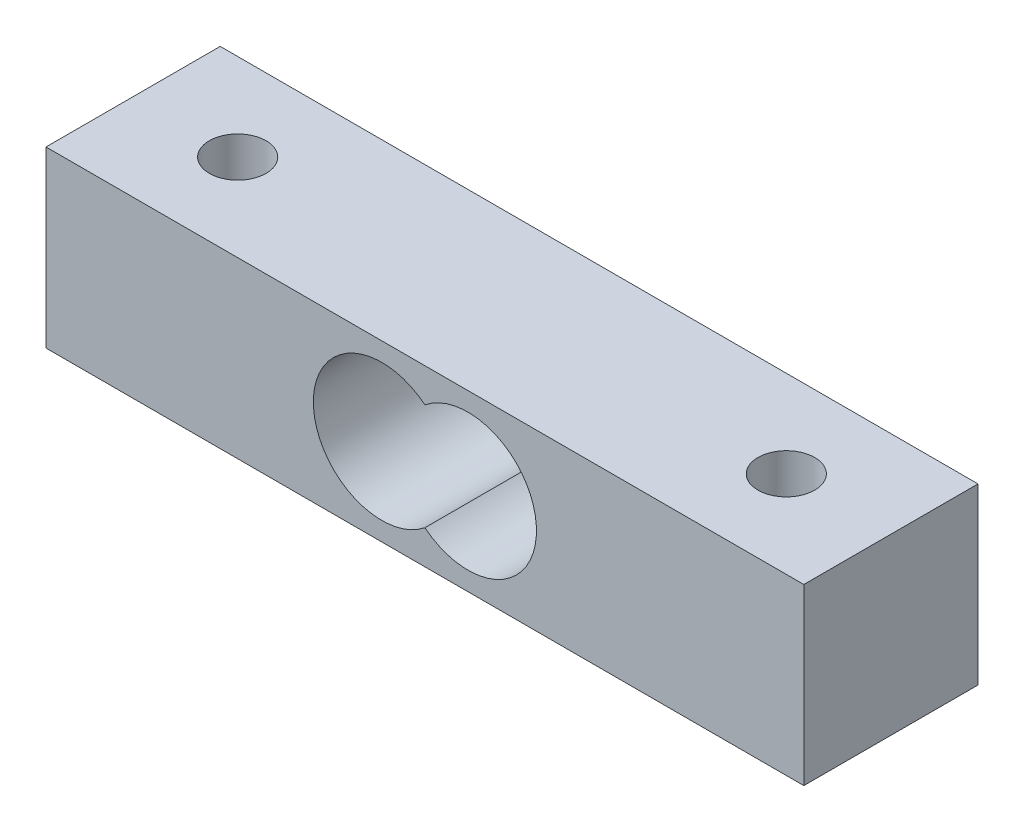
ISO-10303-21;
HEADER;
FILE_DESCRIPTION(('STEP AP214'),'2;1');
FILE_NAME('part.step','',(''),(''),'','','');
FILE_SCHEMA(('AUTOMOTIVE_DESIGN { 1 0 10303 214 1 1 1 1 }'));
ENDSEC;
DATA;
#1=APPLICATION_CONTEXT('core data for automotive mechanical design processes');
#2=APPLICATION_PROTOCOL_DEFINITION('international standard','automotive_design',2000,#1);
#3=PRODUCT_CONTEXT('',#1,'mechanical');
#4=PRODUCT('Part','Part','',(#3));
#5=PRODUCT_RELATED_PRODUCT_CATEGORY('part','',(#4));
#6=PRODUCT_DEFINITION_FORMATION('','',#4);
#7=PRODUCT_DEFINITION_CONTEXT('part definition',#1,'design');
#8=PRODUCT_DEFINITION('design','',#6,#7);
#9=PRODUCT_DEFINITION_SHAPE('','',#8);
#10=(LENGTH_UNIT() NAMED_UNIT(*) SI_UNIT(.MILLI.,.METRE.));
#11=(NAMED_UNIT(*) PLANE_ANGLE_UNIT() SI_UNIT($,.RADIAN.));
#12=(NAMED_UNIT(*) SI_UNIT($,.STERADIAN.) SOLID_ANGLE_UNIT());
#13=UNCERTAINTY_MEASURE_WITH_UNIT(LENGTH_MEASURE(1.E-05),#10,'distance_accuracy_value','');
#14=(GEOMETRIC_REPRESENTATION_CONTEXT(3) GLOBAL_UNCERTAINTY_ASSIGNED_CONTEXT((#13)) GLOBAL_UNIT_ASSIGNED_CONTEXT((#10,
#11,#12)) REPRESENTATION_CONTEXT('',''));
#15=CARTESIAN_POINT('',(0.,0.,0.));
#16=DIRECTION('',(0.,0.,1.));
#17=DIRECTION('',(1.,0.,0.));
#18=AXIS2_PLACEMENT_3D('',#15,#16,#17);
#19=CARTESIAN_POINT('',(-7.625,12.7,6.35));
#20=DIRECTION('',(0.,-1.,0.));
#21=DIRECTION('',(0.,0.,1.));
#22=AXIS2_PLACEMENT_3D('',#19,#20,#21);
#23=CYLINDRICAL_SURFACE('',#22,2.067);
#24=CARTESIAN_POINT('',(-7.625,0.,6.35));
#25=DIRECTION('',(0.,1.,0.));
#26=DIRECTION('',(0.,0.,1.));
#27=AXIS2_PLACEMENT_3D('',#24,#25,#26);
#28=CIRCLE('',#27,2.067);
#29=CARTESIAN_POINT('',(-7.625,0.,8.417));
#30=VERTEX_POINT('',#29);
#31=EDGE_CURVE('E11',#30,#30,#28,.T.);
#32=ORIENTED_EDGE('',*,*,#31,.F.);
#33=EDGE_LOOP('',(#32));
#34=FACE_BOUND('',#33,.T.);
#35=CARTESIAN_POINT('',(-7.625,12.7,6.35));
#36=DIRECTION('',(0.,-1.,0.));
#37=DIRECTION('',(0.,0.,1.));
#38=AXIS2_PLACEMENT_3D('',#35,#36,#37);
#39=CIRCLE('',#38,2.067);
#40=CARTESIAN_POINT('',(-7.625,12.7,8.417));
#41=VERTEX_POINT('',#40);
#42=EDGE_CURVE('E142',#41,#41,#39,.T.);
#43=ORIENTED_EDGE('',*,*,#42,.F.);
#44=EDGE_LOOP('',(#43));
#45=FACE_BOUND('',#44,.T.);
#46=ADVANCED_FACE('F16',(#34,#45),#23,.F.);
#47=CARTESIAN_POINT('',(-47.625,12.7,6.35));
#48=DIRECTION('',(0.,-1.,0.));
#49=DIRECTION('',(0.,0.,1.));
#50=AXIS2_PLACEMENT_3D('',#47,#48,#49);
#51=CYLINDRICAL_SURFACE('',#50,2.067);
#52=CARTESIAN_POINT('',(-47.625,0.,6.35));
#53=DIRECTION('',(0.,1.,0.));
#54=DIRECTION('',(0.,0.,1.));
#55=AXIS2_PLACEMENT_3D('',#52,#53,#54);
#56=CIRCLE('',#55,2.067);
#57=CARTESIAN_POINT('',(-47.625,0.,8.417));
#58=VERTEX_POINT('',#57);
#59=EDGE_CURVE('E27',#58,#58,#56,.T.);
#60=ORIENTED_EDGE('',*,*,#59,.F.);
#61=EDGE_LOOP('',(#60));
#62=FACE_BOUND('',#61,.T.);
#63=CARTESIAN_POINT('',(-47.625,12.7,6.35));
#64=DIRECTION('',(0.,-1.,0.));
#65=DIRECTION('',(0.,0.,1.));
#66=AXIS2_PLACEMENT_3D('',#63,#64,#65);
#67=CIRCLE('',#66,2.067);
#68=CARTESIAN_POINT('',(-47.625,12.7,8.417));
#69=VERTEX_POINT('',#68);
#70=EDGE_CURVE('E146',#69,#69,#67,.T.);
#71=ORIENTED_EDGE('',*,*,#70,.F.);
#72=EDGE_LOOP('',(#71));
#73=FACE_BOUND('',#72,.T.);
#74=ADVANCED_FACE('F205',(#62,#73),#51,.F.);
#75=CARTESIAN_POINT('',(-27.625,0.,0.));
#76=DIRECTION('',(0.,-1.,0.));
#77=DIRECTION('',(0.,0.,-1.));
#78=AXIS2_PLACEMENT_3D('',#75,#76,#77);
#79=PLANE('',#78);
#80=ORIENTED_EDGE('',*,*,#31,.T.);
#81=EDGE_LOOP('',(#80));
#82=FACE_BOUND('',#81,.T.);
#83=ORIENTED_EDGE('',*,*,#59,.T.);
#84=EDGE_LOOP('',(#83));
#85=FACE_BOUND('',#84,.T.);
#86=DIRECTION('',(-1.,0.,0.));
#87=VECTOR('',#86,1.);
#88=CARTESIAN_POINT('',(-55.25,0.,12.7));
#89=LINE('',#88,#87);
#90=CARTESIAN_POINT('',(0.,0.,12.7));
#91=VERTEX_POINT('',#90);
#92=CARTESIAN_POINT('',(-55.25,0.,12.7));
#93=VERTEX_POINT('',#92);
#94=EDGE_CURVE('E104',#91,#93,#89,.T.);
#95=ORIENTED_EDGE('',*,*,#94,.T.);
#96=DIRECTION('',(0.,0.,1.));
#97=VECTOR('',#96,1.);
#98=CARTESIAN_POINT('',(-55.25,0.,0.));
#99=LINE('',#98,#97);
#100=CARTESIAN_POINT('',(-55.25,0.,0.));
#101=VERTEX_POINT('',#100);
#102=EDGE_CURVE('E141',#101,#93,#99,.T.);
#103=ORIENTED_EDGE('',*,*,#102,.F.);
#104=DIRECTION('',(1.,0.,0.));
#105=VECTOR('',#104,1.);
#106=CARTESIAN_POINT('',(-55.25,0.,0.));
#107=LINE('',#106,#105);
#108=CARTESIAN_POINT('',(0.,0.,0.));
#109=VERTEX_POINT('',#108);
#110=EDGE_CURVE('E107',#101,#109,#107,.T.);
#111=ORIENTED_EDGE('',*,*,#110,.T.);
#112=DIRECTION('',(0.,0.,1.));
#113=VECTOR('',#112,1.);
#114=CARTESIAN_POINT('',(0.,0.,0.));
#115=LINE('',#114,#113);
#116=EDGE_CURVE('E96',#109,#91,#115,.T.);
#117=ORIENTED_EDGE('',*,*,#116,.T.);
#118=EDGE_LOOP('',(#95,#103,#111,#117));
#119=FACE_BOUND('',#118,.T.);
#120=ADVANCED_FACE('F103',(#82,#85,#119),#79,.T.);
#121=CARTESIAN_POINT('',(-55.25,6.35,0.));
#122=DIRECTION('',(-1.,0.,0.));
#123=DIRECTION('',(0.,0.,1.));
#124=AXIS2_PLACEMENT_3D('',#121,#122,#123);
#125=PLANE('',#124);
#126=DIRECTION('',(0.,1.,0.));
#127=VECTOR('',#126,1.);
#128=CARTESIAN_POINT('',(-55.25,12.7,12.7));
#129=LINE('',#128,#127);
#130=CARTESIAN_POINT('',(-55.25,12.7,12.7));
#131=VERTEX_POINT('',#130);
#132=EDGE_CURVE('E110',#93,#131,#129,.T.);
#133=ORIENTED_EDGE('',*,*,#132,.T.);
#134=DIRECTION('',(0.,0.,1.));
#135=VECTOR('',#134,1.);
#136=CARTESIAN_POINT('',(-55.25,12.7,0.));
#137=LINE('',#136,#135);
#138=CARTESIAN_POINT('',(-55.25,12.7,0.));
#139=VERTEX_POINT('',#138);
#140=EDGE_CURVE('E124',#139,#131,#137,.T.);
#141=ORIENTED_EDGE('',*,*,#140,.F.);
#142=DIRECTION('',(0.,-1.,0.));
#143=VECTOR('',#142,1.);
#144=CARTESIAN_POINT('',(-55.25,12.7,0.));
#145=LINE('',#144,#143);
#146=EDGE_CURVE('E137',#139,#101,#145,.T.);
#147=ORIENTED_EDGE('',*,*,#146,.T.);
#148=ORIENTED_EDGE('',*,*,#102,.T.);
#149=EDGE_LOOP('',(#133,#141,#147,#148));
#150=FACE_BOUND('',#149,.T.);
#151=ADVANCED_FACE('F188',(#150),#125,.T.);
#152=CARTESIAN_POINT('',(-27.625,12.7,0.));
#153=DIRECTION('',(0.,1.,0.));
#154=DIRECTION('',(1.,0.,0.));
#155=AXIS2_PLACEMENT_3D('',#152,#153,#154);
#156=PLANE('',#155);
#157=ORIENTED_EDGE('',*,*,#42,.T.);
#158=EDGE_LOOP('',(#157));
#159=FACE_BOUND('',#158,.T.);
#160=ORIENTED_EDGE('',*,*,#70,.T.);
#161=EDGE_LOOP('',(#160));
#162=FACE_BOUND('',#161,.T.);
#163=DIRECTION('',(1.,0.,0.));
#164=VECTOR('',#163,1.);
#165=CARTESIAN_POINT('',(0.,12.7,12.7));
#166=LINE('',#165,#164);
#167=CARTESIAN_POINT('',(0.,12.7,12.7));
#168=VERTEX_POINT('',#167);
#169=EDGE_CURVE('E159',#131,#168,#166,.T.);
#170=ORIENTED_EDGE('',*,*,#169,.T.);
#171=DIRECTION('',(0.,0.,1.));
#172=VECTOR('',#171,1.);
#173=CARTESIAN_POINT('',(0.,12.7,0.));
#174=LINE('',#173,#172);
#175=CARTESIAN_POINT('',(0.,12.7,0.));
#176=VERTEX_POINT('',#175);
#177=EDGE_CURVE('E121',#176,#168,#174,.T.);
#178=ORIENTED_EDGE('',*,*,#177,.F.);
#179=DIRECTION('',(-1.,0.,0.));
#180=VECTOR('',#179,1.);
#181=CARTESIAN_POINT('',(0.,12.7,0.));
#182=LINE('',#181,#180);
#183=EDGE_CURVE('E130',#176,#139,#182,.T.);
#184=ORIENTED_EDGE('',*,*,#183,.T.);
#185=ORIENTED_EDGE('',*,*,#140,.T.);
#186=EDGE_LOOP('',(#170,#178,#184,#185));
#187=FACE_BOUND('',#186,.T.);
#188=ADVANCED_FACE('F18',(#159,#162,#187),#156,.T.);
#189=CARTESIAN_POINT('',(0.,6.35,0.));
#190=DIRECTION('',(1.,0.,0.));
#191=DIRECTION('',(0.,0.,1.));
#192=AXIS2_PLACEMENT_3D('',#189,#190,#191);
#193=PLANE('',#192);
#194=DIRECTION('',(0.,-1.,0.));
#195=VECTOR('',#194,1.);
#196=CARTESIAN_POINT('',(0.,0.,12.7));
#197=LINE('',#196,#195);
#198=EDGE_CURVE('E116',#168,#91,#197,.T.);
#199=ORIENTED_EDGE('',*,*,#198,.T.);
#200=ORIENTED_EDGE('',*,*,#116,.F.);
#201=DIRECTION('',(0.,1.,0.));
#202=VECTOR('',#201,1.);
#203=CARTESIAN_POINT('',(0.,0.,0.));
#204=LINE('',#203,#202);
#205=EDGE_CURVE('E125',#109,#176,#204,.T.);
#206=ORIENTED_EDGE('',*,*,#205,.T.);
#207=ORIENTED_EDGE('',*,*,#177,.T.);
#208=EDGE_LOOP('',(#199,#200,#206,#207));
#209=FACE_BOUND('',#208,.T.);
#210=ADVANCED_FACE('F120',(#209),#193,.T.);
#211=CARTESIAN_POINT('',(-24.482611656189,6.35,0.));
#212=DIRECTION('',(0.,0.,1.));
#213=DIRECTION('',(1.,0.,0.));
#214=AXIS2_PLACEMENT_3D('',#211,#212,#213);
#215=CYLINDRICAL_SURFACE('',#214,4.99189467938272);
#216=CARTESIAN_POINT('',(-24.482611656189,6.35,12.7));
#217=DIRECTION('',(0.,0.,1.));
#218=DIRECTION('',(1.,0.,0.));
#219=AXIS2_PLACEMENT_3D('',#216,#217,#218);
#220=CIRCLE('',#219,4.99189467938272);
#221=CARTESIAN_POINT('',(-27.625,2.47128784430578,12.7));
#222=VERTEX_POINT('',#221);
#223=CARTESIAN_POINT('',(-27.625,10.2287121556942,12.7));
#224=VERTEX_POINT('',#223);
#225=EDGE_CURVE('E150',#222,#224,#220,.T.);
#226=ORIENTED_EDGE('',*,*,#225,.T.);
#227=DIRECTION('',(0.,0.,1.));
#228=VECTOR('',#227,1.);
#229=CARTESIAN_POINT('',(-27.625,10.2287121556942,0.));
#230=LINE('',#229,#228);
#231=CARTESIAN_POINT('',(-27.625,10.2287121556942,0.));
#232=VERTEX_POINT('',#231);
#233=EDGE_CURVE('E20',#232,#224,#230,.T.);
#234=ORIENTED_EDGE('',*,*,#233,.F.);
#235=CARTESIAN_POINT('',(-24.482611656189,6.35,0.));
#236=DIRECTION('',(0.,0.,1.));
#237=DIRECTION('',(1.,0.,0.));
#238=AXIS2_PLACEMENT_3D('',#235,#236,#237);
#239=CIRCLE('',#238,4.99189467938272);
#240=CARTESIAN_POINT('',(-27.625,2.47128784430578,0.));
#241=VERTEX_POINT('',#240);
#242=EDGE_CURVE('E174',#241,#232,#239,.T.);
#243=ORIENTED_EDGE('',*,*,#242,.F.);
#244=DIRECTION('',(0.,0.,1.));
#245=VECTOR('',#244,1.);
#246=CARTESIAN_POINT('',(-27.625,2.47128784430578,0.));
#247=LINE('',#246,#245);
#248=EDGE_CURVE('E153',#241,#222,#247,.T.);
#249=ORIENTED_EDGE('',*,*,#248,.T.);
#250=EDGE_LOOP('',(#226,#234,#243,#249));
#251=FACE_BOUND('',#250,.T.);
#252=ADVANCED_FACE('F214',(#251),#215,.F.);
#253=CARTESIAN_POINT('',(-30.767388343811,6.35,0.));
#254=DIRECTION('',(0.,0.,1.));
#255=DIRECTION('',(1.,0.,0.));
#256=AXIS2_PLACEMENT_3D('',#253,#254,#255);
#257=CYLINDRICAL_SURFACE('',#256,4.99189467938272);
#258=CARTESIAN_POINT('',(-30.767388343811,6.35,12.7));
#259=DIRECTION('',(0.,0.,1.));
#260=DIRECTION('',(1.,0.,0.));
#261=AXIS2_PLACEMENT_3D('',#258,#259,#260);
#262=CIRCLE('',#261,4.99189467938272);
#263=EDGE_CURVE('E155',#224,#222,#262,.T.);
#264=ORIENTED_EDGE('',*,*,#263,.T.);
#265=ORIENTED_EDGE('',*,*,#248,.F.);
#266=CARTESIAN_POINT('',(-30.767388343811,6.35,0.));
#267=DIRECTION('',(0.,0.,1.));
#268=DIRECTION('',(1.,0.,0.));
#269=AXIS2_PLACEMENT_3D('',#266,#267,#268);
#270=CIRCLE('',#269,4.99189467938272);
#271=EDGE_CURVE('E171',#232,#241,#270,.T.);
#272=ORIENTED_EDGE('',*,*,#271,.F.);
#273=ORIENTED_EDGE('',*,*,#233,.T.);
#274=EDGE_LOOP('',(#264,#265,#272,#273));
#275=FACE_BOUND('',#274,.T.);
#276=ADVANCED_FACE('F200',(#275),#257,.F.);
#277=CARTESIAN_POINT('',(-27.625,6.35,12.7));
#278=DIRECTION('',(0.,0.,1.));
#279=DIRECTION('',(1.,0.,0.));
#280=AXIS2_PLACEMENT_3D('',#277,#278,#279);
#281=PLANE('',#280);
#282=ORIENTED_EDGE('',*,*,#225,.F.);
#283=ORIENTED_EDGE('',*,*,#263,.F.);
#284=EDGE_LOOP('',(#282,#283));
#285=FACE_BOUND('',#284,.T.);
#286=ORIENTED_EDGE('',*,*,#94,.F.);
#287=ORIENTED_EDGE('',*,*,#198,.F.);
#288=ORIENTED_EDGE('',*,*,#169,.F.);
#289=ORIENTED_EDGE('',*,*,#132,.F.);
#290=EDGE_LOOP('',(#286,#287,#288,#289));
#291=FACE_BOUND('',#290,.T.);
#292=ADVANCED_FACE('F114',(#285,#291),#281,.T.);
#293=CARTESIAN_POINT('',(-27.625,6.35,0.));
#294=DIRECTION('',(0.,0.,1.));
#295=DIRECTION('',(1.,0.,0.));
#296=AXIS2_PLACEMENT_3D('',#293,#294,#295);
#297=PLANE('',#296);
#298=ORIENTED_EDGE('',*,*,#271,.T.);
#299=ORIENTED_EDGE('',*,*,#242,.T.);
#300=EDGE_LOOP('',(#298,#299));
#301=FACE_BOUND('',#300,.T.);
#302=ORIENTED_EDGE('',*,*,#205,.F.);
#303=ORIENTED_EDGE('',*,*,#110,.F.);
#304=ORIENTED_EDGE('',*,*,#146,.F.);
#305=ORIENTED_EDGE('',*,*,#183,.F.);
#306=EDGE_LOOP('',(#302,#303,#304,#305));
#307=FACE_BOUND('',#306,.T.);
#308=ADVANCED_FACE('F193',(#301,#307),#297,.F.);
#309=CLOSED_SHELL('',(#46,#74,#120,#151,#188,#210,#252,#276,#292,#308));
#310=MANIFOLD_SOLID_BREP('B1',#309);
#311=ADVANCED_BREP_SHAPE_REPRESENTATION('',(#18,#310),#14);
#312=SHAPE_DEFINITION_REPRESENTATION(#9,#311);
ENDSEC;
END-ISO-10303-21;
